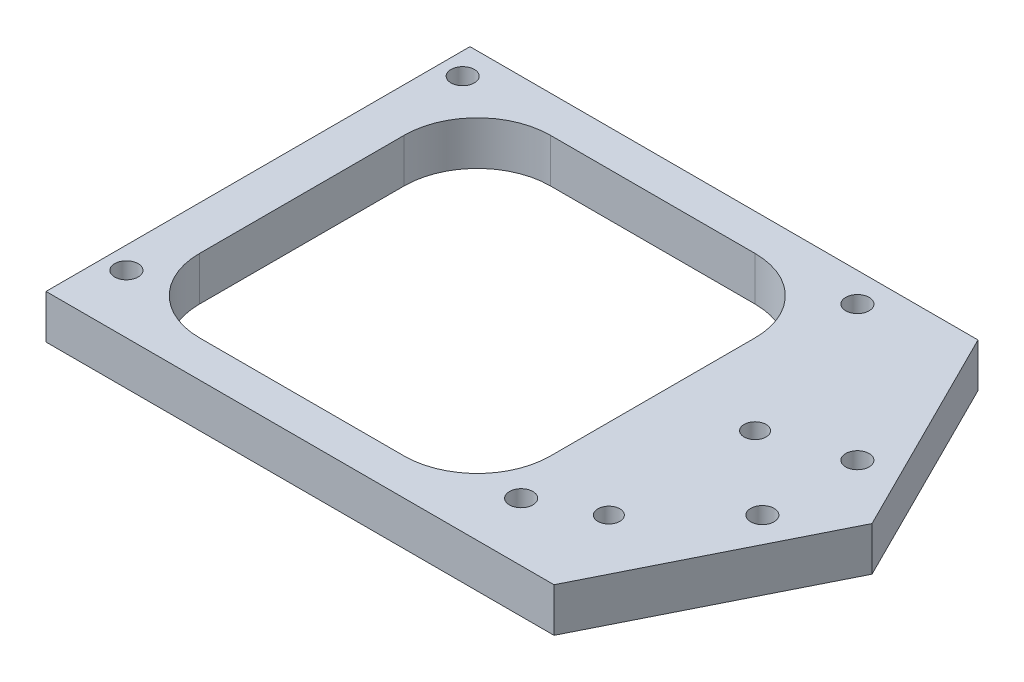
ISO-10303-21;
HEADER;
FILE_DESCRIPTION(('STEP AP214'),'2;1');
FILE_NAME('part.step','',(''),(''),'','','');
FILE_SCHEMA(('AUTOMOTIVE_DESIGN { 1 0 10303 214 1 1 1 1 }'));
ENDSEC;
DATA;
#1=APPLICATION_CONTEXT('core data for automotive mechanical design processes');
#2=APPLICATION_PROTOCOL_DEFINITION('international standard','automotive_design',2000,#1);
#3=PRODUCT_CONTEXT('',#1,'mechanical');
#4=PRODUCT('Part','Part','',(#3));
#5=PRODUCT_RELATED_PRODUCT_CATEGORY('part','',(#4));
#6=PRODUCT_DEFINITION_FORMATION('','',#4);
#7=PRODUCT_DEFINITION_CONTEXT('part definition',#1,'design');
#8=PRODUCT_DEFINITION('design','',#6,#7);
#9=PRODUCT_DEFINITION_SHAPE('','',#8);
#10=(LENGTH_UNIT() NAMED_UNIT(*) SI_UNIT(.MILLI.,.METRE.));
#11=(NAMED_UNIT(*) PLANE_ANGLE_UNIT() SI_UNIT($,.RADIAN.));
#12=(NAMED_UNIT(*) SI_UNIT($,.STERADIAN.) SOLID_ANGLE_UNIT());
#13=UNCERTAINTY_MEASURE_WITH_UNIT(LENGTH_MEASURE(1.E-05),#10,'distance_accuracy_value','');
#14=(GEOMETRIC_REPRESENTATION_CONTEXT(3) GLOBAL_UNCERTAINTY_ASSIGNED_CONTEXT((#13)) GLOBAL_UNIT_ASSIGNED_CONTEXT((#10,
#11,#12)) REPRESENTATION_CONTEXT('',''));
#15=CARTESIAN_POINT('',(0.,0.,0.));
#16=DIRECTION('',(0.,0.,1.));
#17=DIRECTION('',(1.,0.,0.));
#18=AXIS2_PLACEMENT_3D('',#15,#16,#17);
#19=CARTESIAN_POINT('',(0.,-1.5,0.));
#20=DIRECTION('',(0.,-1.,0.));
#21=DIRECTION('',(0.,0.,-1.));
#22=AXIS2_PLACEMENT_3D('',#19,#20,#21);
#23=PLANE('',#22);
#24=CARTESIAN_POINT('',(32.5,-1.5,-16.));
#25=DIRECTION('',(0.,1.,0.));
#26=DIRECTION('',(0.,0.,1.));
#27=AXIS2_PLACEMENT_3D('',#24,#25,#26);
#28=CIRCLE('',#27,0.750000000000001);
#29=CARTESIAN_POINT('',(32.5,-1.5,-15.25));
#30=VERTEX_POINT('',#29);
#31=EDGE_CURVE('E332',#30,#30,#28,.T.);
#32=ORIENTED_EDGE('',*,*,#31,.T.);
#33=EDGE_LOOP('',(#32));
#34=FACE_BOUND('',#33,.T.);
#35=DIRECTION('',(0.,0.,1.));
#36=VECTOR('',#35,1.);
#37=CARTESIAN_POINT('',(0.,-1.5,0.));
#38=LINE('',#37,#36);
#39=CARTESIAN_POINT('',(0.,-1.5,-29.));
#40=VERTEX_POINT('',#39);
#41=CARTESIAN_POINT('',(0.,-1.5,0.));
#42=VERTEX_POINT('',#41);
#43=EDGE_CURVE('E170',#40,#42,#38,.T.);
#44=ORIENTED_EDGE('',*,*,#43,.F.);
#45=DIRECTION('',(-1.,0.,0.));
#46=VECTOR('',#45,1.);
#47=CARTESIAN_POINT('',(0.,-1.5,-29.));
#48=LINE('',#47,#46);
#49=CARTESIAN_POINT('',(34.7484344171534,-1.5,-29.));
#50=VERTEX_POINT('',#49);
#51=EDGE_CURVE('E166',#50,#40,#48,.T.);
#52=ORIENTED_EDGE('',*,*,#51,.F.);
#53=DIRECTION('',(-0.447290848418716,0.,-0.894388560370081));
#54=VECTOR('',#53,1.);
#55=CARTESIAN_POINT('',(42.,-1.5,-14.5));
#56=LINE('',#55,#54);
#57=CARTESIAN_POINT('',(42.,-1.5,-14.5));
#58=VERTEX_POINT('',#57);
#59=EDGE_CURVE('E248',#58,#50,#56,.T.);
#60=ORIENTED_EDGE('',*,*,#59,.F.);
#61=DIRECTION('',(0.447290848418714,0.,-0.894388560370081));
#62=VECTOR('',#61,1.);
#63=CARTESIAN_POINT('',(42.,-1.5,-14.5));
#64=LINE('',#63,#62);
#65=CARTESIAN_POINT('',(34.7484344171535,-1.5,0.));
#66=VERTEX_POINT('',#65);
#67=EDGE_CURVE('E246',#66,#58,#64,.T.);
#68=ORIENTED_EDGE('',*,*,#67,.F.);
#69=DIRECTION('',(1.,0.,0.));
#70=VECTOR('',#69,1.);
#71=CARTESIAN_POINT('',(0.,-1.5,0.));
#72=LINE('',#71,#70);
#73=EDGE_CURVE('E244',#42,#66,#72,.T.);
#74=ORIENTED_EDGE('',*,*,#73,.F.);
#75=EDGE_LOOP('',(#44,#52,#60,#68,#74));
#76=FACE_BOUND('',#75,.T.);
#77=DIRECTION('',(-1.,0.,0.));
#78=VECTOR('',#77,1.);
#79=CARTESIAN_POINT('',(3.,-1.5,-26.5));
#80=LINE('',#79,#78);
#81=CARTESIAN_POINT('',(22.,-1.5,-26.5));
#82=VERTEX_POINT('',#81);
#83=CARTESIAN_POINT('',(8.,-1.5,-26.5));
#84=VERTEX_POINT('',#83);
#85=EDGE_CURVE('E231',#82,#84,#80,.T.);
#86=ORIENTED_EDGE('',*,*,#85,.T.);
#87=CARTESIAN_POINT('',(8.,-1.5,-21.5));
#88=DIRECTION('',(0.,-1.,0.));
#89=DIRECTION('',(0.,0.,-1.));
#90=AXIS2_PLACEMENT_3D('',#87,#88,#89);
#91=CIRCLE('',#90,5.);
#92=CARTESIAN_POINT('',(3.,-1.5,-21.5));
#93=VERTEX_POINT('',#92);
#94=EDGE_CURVE('E197',#84,#93,#91,.F.);
#95=ORIENTED_EDGE('',*,*,#94,.T.);
#96=DIRECTION('',(0.,0.,1.));
#97=VECTOR('',#96,1.);
#98=CARTESIAN_POINT('',(3.,-1.5,-26.5));
#99=LINE('',#98,#97);
#100=CARTESIAN_POINT('',(3.,-1.5,-7.50000000000001));
#101=VERTEX_POINT('',#100);
#102=EDGE_CURVE('E224',#93,#101,#99,.T.);
#103=ORIENTED_EDGE('',*,*,#102,.T.);
#104=CARTESIAN_POINT('',(8.,-1.5,-7.5));
#105=DIRECTION('',(0.,-1.,0.));
#106=DIRECTION('',(0.,0.,-1.));
#107=AXIS2_PLACEMENT_3D('',#104,#105,#106);
#108=CIRCLE('',#107,5.);
#109=CARTESIAN_POINT('',(8.,-1.5,-2.5));
#110=VERTEX_POINT('',#109);
#111=EDGE_CURVE('E13',#101,#110,#108,.F.);
#112=ORIENTED_EDGE('',*,*,#111,.T.);
#113=DIRECTION('',(1.,0.,0.));
#114=VECTOR('',#113,1.);
#115=CARTESIAN_POINT('',(3.,-1.5,-2.5));
#116=LINE('',#115,#114);
#117=CARTESIAN_POINT('',(22.,-1.5,-2.5));
#118=VERTEX_POINT('',#117);
#119=EDGE_CURVE('E222',#110,#118,#116,.T.);
#120=ORIENTED_EDGE('',*,*,#119,.T.);
#121=CARTESIAN_POINT('',(22.,-1.5,-7.5));
#122=DIRECTION('',(0.,-1.,0.));
#123=DIRECTION('',(0.,0.,-1.));
#124=AXIS2_PLACEMENT_3D('',#121,#122,#123);
#125=CIRCLE('',#124,5.);
#126=CARTESIAN_POINT('',(27.,-1.5,-7.50000000000001));
#127=VERTEX_POINT('',#126);
#128=EDGE_CURVE('E204',#118,#127,#125,.F.);
#129=ORIENTED_EDGE('',*,*,#128,.T.);
#130=DIRECTION('',(0.,0.,-1.));
#131=VECTOR('',#130,1.);
#132=CARTESIAN_POINT('',(27.,-1.5,-26.5));
#133=LINE('',#132,#131);
#134=CARTESIAN_POINT('',(27.,-1.5,-21.5));
#135=VERTEX_POINT('',#134);
#136=EDGE_CURVE('E228',#127,#135,#133,.T.);
#137=ORIENTED_EDGE('',*,*,#136,.T.);
#138=CARTESIAN_POINT('',(22.,-1.5,-21.5));
#139=DIRECTION('',(0.,-1.,0.));
#140=DIRECTION('',(0.,0.,-1.));
#141=AXIS2_PLACEMENT_3D('',#138,#139,#140);
#142=CIRCLE('',#141,5.);
#143=EDGE_CURVE('E201',#135,#82,#142,.F.);
#144=ORIENTED_EDGE('',*,*,#143,.T.);
#145=EDGE_LOOP('',(#86,#95,#103,#112,#120,#129,#137,#144));
#146=FACE_BOUND('',#145,.T.);
#147=CARTESIAN_POINT('',(1.5,-1.5,-4.));
#148=DIRECTION('',(0.,1.,0.));
#149=DIRECTION('',(0.,0.,1.));
#150=AXIS2_PLACEMENT_3D('',#147,#148,#149);
#151=CIRCLE('',#150,0.799999999999995);
#152=CARTESIAN_POINT('',(1.5,-1.5,-3.20000000000001));
#153=VERTEX_POINT('',#152);
#154=EDGE_CURVE('E214',#153,#153,#151,.T.);
#155=ORIENTED_EDGE('',*,*,#154,.T.);
#156=EDGE_LOOP('',(#155));
#157=FACE_BOUND('',#156,.T.);
#158=CARTESIAN_POINT('',(28.5,-1.5,-4.00000000000001));
#159=DIRECTION('',(0.,1.,0.));
#160=DIRECTION('',(0.,0.,1.));
#161=AXIS2_PLACEMENT_3D('',#158,#159,#160);
#162=CIRCLE('',#161,0.799999999999995);
#163=CARTESIAN_POINT('',(28.5,-1.5,-3.20000000000001));
#164=VERTEX_POINT('',#163);
#165=EDGE_CURVE('E372',#164,#164,#162,.T.);
#166=ORIENTED_EDGE('',*,*,#165,.T.);
#167=EDGE_LOOP('',(#166));
#168=FACE_BOUND('',#167,.T.);
#169=CARTESIAN_POINT('',(37.7484344171534,-1.5,-11.25));
#170=DIRECTION('',(0.,1.,0.));
#171=DIRECTION('',(0.,0.,1.));
#172=AXIS2_PLACEMENT_3D('',#169,#170,#171);
#173=CIRCLE('',#172,0.799999999999995);
#174=CARTESIAN_POINT('',(37.7484344171534,-1.5,-10.45));
#175=VERTEX_POINT('',#174);
#176=EDGE_CURVE('E366',#175,#175,#173,.T.);
#177=ORIENTED_EDGE('',*,*,#176,.T.);
#178=EDGE_LOOP('',(#177));
#179=FACE_BOUND('',#178,.T.);
#180=CARTESIAN_POINT('',(37.7484344171534,-1.5,-17.75));
#181=DIRECTION('',(0.,1.,0.));
#182=DIRECTION('',(0.,0.,1.));
#183=AXIS2_PLACEMENT_3D('',#180,#181,#182);
#184=CIRCLE('',#183,0.799999999999995);
#185=CARTESIAN_POINT('',(37.7484344171534,-1.5,-16.95));
#186=VERTEX_POINT('',#185);
#187=EDGE_CURVE('E360',#186,#186,#184,.T.);
#188=ORIENTED_EDGE('',*,*,#187,.T.);
#189=EDGE_LOOP('',(#188));
#190=FACE_BOUND('',#189,.T.);
#191=CARTESIAN_POINT('',(28.5,-1.5,-27.));
#192=DIRECTION('',(0.,1.,0.));
#193=DIRECTION('',(0.,0.,1.));
#194=AXIS2_PLACEMENT_3D('',#191,#192,#193);
#195=CIRCLE('',#194,0.799999999999995);
#196=CARTESIAN_POINT('',(28.5,-1.5,-26.2));
#197=VERTEX_POINT('',#196);
#198=EDGE_CURVE('E354',#197,#197,#195,.T.);
#199=ORIENTED_EDGE('',*,*,#198,.T.);
#200=EDGE_LOOP('',(#199));
#201=FACE_BOUND('',#200,.T.);
#202=CARTESIAN_POINT('',(1.5,-1.5,-27.));
#203=DIRECTION('',(0.,1.,0.));
#204=DIRECTION('',(0.,0.,1.));
#205=AXIS2_PLACEMENT_3D('',#202,#203,#204);
#206=CIRCLE('',#205,0.799999999999996);
#207=CARTESIAN_POINT('',(1.5,-1.5,-26.2));
#208=VERTEX_POINT('',#207);
#209=EDGE_CURVE('E348',#208,#208,#206,.T.);
#210=ORIENTED_EDGE('',*,*,#209,.T.);
#211=EDGE_LOOP('',(#210));
#212=FACE_BOUND('',#211,.T.);
#213=CARTESIAN_POINT('',(32.5,-1.5,-6.));
#214=DIRECTION('',(0.,1.,0.));
#215=DIRECTION('',(0.,0.,1.));
#216=AXIS2_PLACEMENT_3D('',#213,#214,#215);
#217=CIRCLE('',#216,0.750000000000001);
#218=CARTESIAN_POINT('',(32.5,-1.5,-5.25));
#219=VERTEX_POINT('',#218);
#220=EDGE_CURVE('E342',#219,#219,#217,.T.);
#221=ORIENTED_EDGE('',*,*,#220,.T.);
#222=EDGE_LOOP('',(#221));
#223=FACE_BOUND('',#222,.T.);
#224=ADVANCED_FACE('F50',(#34,#76,#146,#157,#168,#179,#190,#201,#212,#223),#23,.T.);
#225=CARTESIAN_POINT('',(0.,1.5,0.));
#226=DIRECTION('',(0.,-1.,0.));
#227=DIRECTION('',(0.,0.,-1.));
#228=AXIS2_PLACEMENT_3D('',#225,#226,#227);
#229=PLANE('',#228);
#230=CARTESIAN_POINT('',(32.5,1.5,-16.));
#231=DIRECTION('',(0.,1.,0.));
#232=DIRECTION('',(0.,0.,1.));
#233=AXIS2_PLACEMENT_3D('',#230,#231,#232);
#234=CIRCLE('',#233,0.750000000000001);
#235=CARTESIAN_POINT('',(32.5,1.5,-15.25));
#236=VERTEX_POINT('',#235);
#237=EDGE_CURVE('E335',#236,#236,#234,.T.);
#238=ORIENTED_EDGE('',*,*,#237,.F.);
#239=EDGE_LOOP('',(#238));
#240=FACE_BOUND('',#239,.T.);
#241=CARTESIAN_POINT('',(1.5,1.5,-27.));
#242=DIRECTION('',(0.,1.,0.));
#243=DIRECTION('',(0.,0.,1.));
#244=AXIS2_PLACEMENT_3D('',#241,#242,#243);
#245=CIRCLE('',#244,0.799999999999988);
#246=CARTESIAN_POINT('',(1.5,1.5,-26.2));
#247=VERTEX_POINT('',#246);
#248=EDGE_CURVE('E345',#247,#247,#245,.T.);
#249=ORIENTED_EDGE('',*,*,#248,.F.);
#250=EDGE_LOOP('',(#249));
#251=FACE_BOUND('',#250,.T.);
#252=CARTESIAN_POINT('',(28.5,1.5,-27.));
#253=DIRECTION('',(0.,1.,0.));
#254=DIRECTION('',(0.,0.,1.));
#255=AXIS2_PLACEMENT_3D('',#252,#253,#254);
#256=CIRCLE('',#255,0.799999999999988);
#257=CARTESIAN_POINT('',(28.5,1.5,-26.2));
#258=VERTEX_POINT('',#257);
#259=EDGE_CURVE('E351',#258,#258,#256,.T.);
#260=ORIENTED_EDGE('',*,*,#259,.F.);
#261=EDGE_LOOP('',(#260));
#262=FACE_BOUND('',#261,.T.);
#263=CARTESIAN_POINT('',(37.7484344171534,1.5,-17.75));
#264=DIRECTION('',(0.,1.,0.));
#265=DIRECTION('',(0.,0.,1.));
#266=AXIS2_PLACEMENT_3D('',#263,#264,#265);
#267=CIRCLE('',#266,0.799999999999988);
#268=CARTESIAN_POINT('',(37.7484344171534,1.5,-16.95));
#269=VERTEX_POINT('',#268);
#270=EDGE_CURVE('E357',#269,#269,#267,.T.);
#271=ORIENTED_EDGE('',*,*,#270,.F.);
#272=EDGE_LOOP('',(#271));
#273=FACE_BOUND('',#272,.T.);
#274=CARTESIAN_POINT('',(37.7484344171534,1.5,-11.25));
#275=DIRECTION('',(0.,1.,0.));
#276=DIRECTION('',(0.,0.,1.));
#277=AXIS2_PLACEMENT_3D('',#274,#275,#276);
#278=CIRCLE('',#277,0.799999999999988);
#279=CARTESIAN_POINT('',(37.7484344171534,1.5,-10.45));
#280=VERTEX_POINT('',#279);
#281=EDGE_CURVE('E363',#280,#280,#278,.T.);
#282=ORIENTED_EDGE('',*,*,#281,.F.);
#283=EDGE_LOOP('',(#282));
#284=FACE_BOUND('',#283,.T.);
#285=CARTESIAN_POINT('',(28.5,1.5,-4.00000000000001));
#286=DIRECTION('',(0.,1.,0.));
#287=DIRECTION('',(0.,0.,1.));
#288=AXIS2_PLACEMENT_3D('',#285,#286,#287);
#289=CIRCLE('',#288,0.799999999999988);
#290=CARTESIAN_POINT('',(28.5,1.5,-3.20000000000002));
#291=VERTEX_POINT('',#290);
#292=EDGE_CURVE('E369',#291,#291,#289,.T.);
#293=ORIENTED_EDGE('',*,*,#292,.F.);
#294=EDGE_LOOP('',(#293));
#295=FACE_BOUND('',#294,.T.);
#296=DIRECTION('',(1.,0.,0.));
#297=VECTOR('',#296,1.);
#298=CARTESIAN_POINT('',(3.,1.5,-2.5));
#299=LINE('',#298,#297);
#300=CARTESIAN_POINT('',(8.,1.5,-2.5));
#301=VERTEX_POINT('',#300);
#302=CARTESIAN_POINT('',(22.,1.5,-2.5));
#303=VERTEX_POINT('',#302);
#304=EDGE_CURVE('E208',#301,#303,#299,.T.);
#305=ORIENTED_EDGE('',*,*,#304,.F.);
#306=CARTESIAN_POINT('',(8.,1.5,-7.5));
#307=DIRECTION('',(0.,-1.,0.));
#308=DIRECTION('',(0.,0.,-1.));
#309=AXIS2_PLACEMENT_3D('',#306,#307,#308);
#310=CIRCLE('',#309,5.);
#311=CARTESIAN_POINT('',(3.,1.5,-7.50000000000001));
#312=VERTEX_POINT('',#311);
#313=EDGE_CURVE('E58',#301,#312,#310,.T.);
#314=ORIENTED_EDGE('',*,*,#313,.T.);
#315=DIRECTION('',(0.,0.,1.));
#316=VECTOR('',#315,1.);
#317=CARTESIAN_POINT('',(3.,1.5,-26.5));
#318=LINE('',#317,#316);
#319=CARTESIAN_POINT('',(3.,1.5,-21.5));
#320=VERTEX_POINT('',#319);
#321=EDGE_CURVE('E207',#320,#312,#318,.T.);
#322=ORIENTED_EDGE('',*,*,#321,.F.);
#323=CARTESIAN_POINT('',(8.,1.5,-21.5));
#324=DIRECTION('',(0.,-1.,0.));
#325=DIRECTION('',(0.,0.,-1.));
#326=AXIS2_PLACEMENT_3D('',#323,#324,#325);
#327=CIRCLE('',#326,5.);
#328=CARTESIAN_POINT('',(8.,1.5,-26.5));
#329=VERTEX_POINT('',#328);
#330=EDGE_CURVE('E195',#320,#329,#327,.T.);
#331=ORIENTED_EDGE('',*,*,#330,.T.);
#332=DIRECTION('',(-1.,0.,0.));
#333=VECTOR('',#332,1.);
#334=CARTESIAN_POINT('',(3.,1.5,-26.5));
#335=LINE('',#334,#333);
#336=CARTESIAN_POINT('',(22.,1.5,-26.5));
#337=VERTEX_POINT('',#336);
#338=EDGE_CURVE('E233',#337,#329,#335,.T.);
#339=ORIENTED_EDGE('',*,*,#338,.F.);
#340=CARTESIAN_POINT('',(22.,1.5,-21.5));
#341=DIRECTION('',(0.,-1.,0.));
#342=DIRECTION('',(0.,0.,-1.));
#343=AXIS2_PLACEMENT_3D('',#340,#341,#342);
#344=CIRCLE('',#343,5.);
#345=CARTESIAN_POINT('',(27.,1.5,-21.5));
#346=VERTEX_POINT('',#345);
#347=EDGE_CURVE('E199',#337,#346,#344,.T.);
#348=ORIENTED_EDGE('',*,*,#347,.T.);
#349=DIRECTION('',(0.,0.,-1.));
#350=VECTOR('',#349,1.);
#351=CARTESIAN_POINT('',(27.,1.5,-26.5));
#352=LINE('',#351,#350);
#353=CARTESIAN_POINT('',(27.,1.5,-7.50000000000001));
#354=VERTEX_POINT('',#353);
#355=EDGE_CURVE('E381',#354,#346,#352,.T.);
#356=ORIENTED_EDGE('',*,*,#355,.F.);
#357=CARTESIAN_POINT('',(22.,1.5,-7.5));
#358=DIRECTION('',(0.,-1.,0.));
#359=DIRECTION('',(0.,0.,-1.));
#360=AXIS2_PLACEMENT_3D('',#357,#358,#359);
#361=CIRCLE('',#360,5.);
#362=EDGE_CURVE('E65',#354,#303,#361,.T.);
#363=ORIENTED_EDGE('',*,*,#362,.T.);
#364=EDGE_LOOP('',(#305,#314,#322,#331,#339,#348,#356,#363));
#365=FACE_BOUND('',#364,.T.);
#366=DIRECTION('',(0.,0.,1.));
#367=VECTOR('',#366,1.);
#368=CARTESIAN_POINT('',(0.,1.5,0.));
#369=LINE('',#368,#367);
#370=CARTESIAN_POINT('',(0.,1.5,-29.));
#371=VERTEX_POINT('',#370);
#372=CARTESIAN_POINT('',(0.,1.5,0.));
#373=VERTEX_POINT('',#372);
#374=EDGE_CURVE('E156',#371,#373,#369,.T.);
#375=ORIENTED_EDGE('',*,*,#374,.T.);
#376=DIRECTION('',(1.,0.,0.));
#377=VECTOR('',#376,1.);
#378=CARTESIAN_POINT('',(0.,1.5,0.));
#379=LINE('',#378,#377);
#380=CARTESIAN_POINT('',(34.7484344171535,1.5,0.));
#381=VERTEX_POINT('',#380);
#382=EDGE_CURVE('E145',#373,#381,#379,.T.);
#383=ORIENTED_EDGE('',*,*,#382,.T.);
#384=DIRECTION('',(0.447290848418714,0.,-0.894388560370081));
#385=VECTOR('',#384,1.);
#386=CARTESIAN_POINT('',(42.,1.5,-14.5));
#387=LINE('',#386,#385);
#388=CARTESIAN_POINT('',(42.,1.5,-14.5));
#389=VERTEX_POINT('',#388);
#390=EDGE_CURVE('E155',#381,#389,#387,.T.);
#391=ORIENTED_EDGE('',*,*,#390,.T.);
#392=DIRECTION('',(-0.447290848418716,0.,-0.894388560370081));
#393=VECTOR('',#392,1.);
#394=CARTESIAN_POINT('',(42.,1.5,-14.5));
#395=LINE('',#394,#393);
#396=CARTESIAN_POINT('',(34.7484344171534,1.5,-29.));
#397=VERTEX_POINT('',#396);
#398=EDGE_CURVE('E239',#389,#397,#395,.T.);
#399=ORIENTED_EDGE('',*,*,#398,.T.);
#400=DIRECTION('',(-1.,0.,0.));
#401=VECTOR('',#400,1.);
#402=CARTESIAN_POINT('',(0.,1.5,-29.));
#403=LINE('',#402,#401);
#404=EDGE_CURVE('E162',#397,#371,#403,.T.);
#405=ORIENTED_EDGE('',*,*,#404,.T.);
#406=EDGE_LOOP('',(#375,#383,#391,#399,#405));
#407=FACE_BOUND('',#406,.T.);
#408=CARTESIAN_POINT('',(1.5,1.5,-4.));
#409=DIRECTION('',(0.,1.,0.));
#410=DIRECTION('',(0.,0.,1.));
#411=AXIS2_PLACEMENT_3D('',#408,#409,#410);
#412=CIRCLE('',#411,0.799999999999988);
#413=CARTESIAN_POINT('',(1.5,1.5,-3.20000000000002));
#414=VERTEX_POINT('',#413);
#415=EDGE_CURVE('E375',#414,#414,#412,.T.);
#416=ORIENTED_EDGE('',*,*,#415,.F.);
#417=EDGE_LOOP('',(#416));
#418=FACE_BOUND('',#417,.T.);
#419=CARTESIAN_POINT('',(32.5,1.5,-6.));
#420=DIRECTION('',(0.,1.,0.));
#421=DIRECTION('',(0.,0.,1.));
#422=AXIS2_PLACEMENT_3D('',#419,#420,#421);
#423=CIRCLE('',#422,0.750000000000001);
#424=CARTESIAN_POINT('',(32.5,1.5,-5.25));
#425=VERTEX_POINT('',#424);
#426=EDGE_CURVE('E337',#425,#425,#423,.T.);
#427=ORIENTED_EDGE('',*,*,#426,.F.);
#428=EDGE_LOOP('',(#427));
#429=FACE_BOUND('',#428,.T.);
#430=ADVANCED_FACE('F159',(#240,#251,#262,#273,#284,#295,#365,#407,#418,#429),#229,.F.);
#431=CARTESIAN_POINT('',(0.,1.5,0.));
#432=DIRECTION('',(1.,0.,0.));
#433=DIRECTION('',(0.,0.,-1.));
#434=AXIS2_PLACEMENT_3D('',#431,#432,#433);
#435=PLANE('',#434);
#436=ORIENTED_EDGE('',*,*,#43,.T.);
#437=DIRECTION('',(0.,-1.,0.));
#438=VECTOR('',#437,1.);
#439=CARTESIAN_POINT('',(0.,1.5,0.));
#440=LINE('',#439,#438);
#441=EDGE_CURVE('E149',#373,#42,#440,.T.);
#442=ORIENTED_EDGE('',*,*,#441,.F.);
#443=ORIENTED_EDGE('',*,*,#374,.F.);
#444=DIRECTION('',(0.,-1.,0.));
#445=VECTOR('',#444,1.);
#446=CARTESIAN_POINT('',(0.,1.5,-29.));
#447=LINE('',#446,#445);
#448=EDGE_CURVE('E242',#371,#40,#447,.T.);
#449=ORIENTED_EDGE('',*,*,#448,.T.);
#450=EDGE_LOOP('',(#436,#442,#443,#449));
#451=FACE_BOUND('',#450,.T.);
#452=ADVANCED_FACE('F168',(#451),#435,.F.);
#453=CARTESIAN_POINT('',(0.,1.5,0.));
#454=DIRECTION('',(0.,0.,-1.));
#455=DIRECTION('',(-1.,0.,0.));
#456=AXIS2_PLACEMENT_3D('',#453,#454,#455);
#457=PLANE('',#456);
#458=ORIENTED_EDGE('',*,*,#73,.T.);
#459=DIRECTION('',(0.,-1.,0.));
#460=VECTOR('',#459,1.);
#461=CARTESIAN_POINT('',(34.7484344171535,1.5,0.));
#462=LINE('',#461,#460);
#463=EDGE_CURVE('E152',#381,#66,#462,.T.);
#464=ORIENTED_EDGE('',*,*,#463,.F.);
#465=ORIENTED_EDGE('',*,*,#382,.F.);
#466=ORIENTED_EDGE('',*,*,#441,.T.);
#467=EDGE_LOOP('',(#458,#464,#465,#466));
#468=FACE_BOUND('',#467,.T.);
#469=ADVANCED_FACE('F147',(#468),#457,.F.);
#470=CARTESIAN_POINT('',(42.,1.5,-14.5));
#471=DIRECTION('',(-0.894388560370082,0.,-0.447290848418714));
#472=DIRECTION('',(-0.447290848418714,0.,0.894388560370082));
#473=AXIS2_PLACEMENT_3D('',#470,#471,#472);
#474=PLANE('',#473);
#475=ORIENTED_EDGE('',*,*,#67,.T.);
#476=DIRECTION('',(0.,-1.,0.));
#477=VECTOR('',#476,1.);
#478=CARTESIAN_POINT('',(42.,1.5,-14.5));
#479=LINE('',#478,#477);
#480=EDGE_CURVE('E175',#389,#58,#479,.T.);
#481=ORIENTED_EDGE('',*,*,#480,.F.);
#482=ORIENTED_EDGE('',*,*,#390,.F.);
#483=ORIENTED_EDGE('',*,*,#463,.T.);
#484=EDGE_LOOP('',(#475,#481,#482,#483));
#485=FACE_BOUND('',#484,.T.);
#486=ADVANCED_FACE('F275',(#485),#474,.F.);
#487=CARTESIAN_POINT('',(42.,1.5,-14.5));
#488=DIRECTION('',(-0.894388560370081,0.,0.447290848418716));
#489=DIRECTION('',(0.447290848418716,0.,0.894388560370081));
#490=AXIS2_PLACEMENT_3D('',#487,#488,#489);
#491=PLANE('',#490);
#492=ORIENTED_EDGE('',*,*,#59,.T.);
#493=DIRECTION('',(0.,-1.,0.));
#494=VECTOR('',#493,1.);
#495=CARTESIAN_POINT('',(34.7484344171534,1.5,-29.));
#496=LINE('',#495,#494);
#497=EDGE_CURVE('E252',#397,#50,#496,.T.);
#498=ORIENTED_EDGE('',*,*,#497,.F.);
#499=ORIENTED_EDGE('',*,*,#398,.F.);
#500=ORIENTED_EDGE('',*,*,#480,.T.);
#501=EDGE_LOOP('',(#492,#498,#499,#500));
#502=FACE_BOUND('',#501,.T.);
#503=ADVANCED_FACE('F259',(#502),#491,.F.);
#504=CARTESIAN_POINT('',(0.,1.5,-29.));
#505=DIRECTION('',(0.,0.,1.));
#506=DIRECTION('',(1.,0.,0.));
#507=AXIS2_PLACEMENT_3D('',#504,#505,#506);
#508=PLANE('',#507);
#509=ORIENTED_EDGE('',*,*,#51,.T.);
#510=ORIENTED_EDGE('',*,*,#448,.F.);
#511=ORIENTED_EDGE('',*,*,#404,.F.);
#512=ORIENTED_EDGE('',*,*,#497,.T.);
#513=EDGE_LOOP('',(#509,#510,#511,#512));
#514=FACE_BOUND('',#513,.T.);
#515=ADVANCED_FACE('F266',(#514),#508,.F.);
#516=CARTESIAN_POINT('',(3.,-1.5,-26.5));
#517=DIRECTION('',(-1.,0.,0.));
#518=DIRECTION('',(0.,0.,1.));
#519=AXIS2_PLACEMENT_3D('',#516,#517,#518);
#520=PLANE('',#519);
#521=ORIENTED_EDGE('',*,*,#102,.F.);
#522=DIRECTION('',(0.,1.,0.));
#523=VECTOR('',#522,1.);
#524=CARTESIAN_POINT('',(3.,1.5,-21.5));
#525=LINE('',#524,#523);
#526=EDGE_CURVE('E173',#93,#320,#525,.T.);
#527=ORIENTED_EDGE('',*,*,#526,.T.);
#528=ORIENTED_EDGE('',*,*,#321,.T.);
#529=DIRECTION('',(0.,1.,0.));
#530=VECTOR('',#529,1.);
#531=CARTESIAN_POINT('',(3.,-1.5,-7.5));
#532=LINE('',#531,#530);
#533=EDGE_CURVE('E171',#312,#101,#532,.F.);
#534=ORIENTED_EDGE('',*,*,#533,.T.);
#535=EDGE_LOOP('',(#521,#527,#528,#534));
#536=FACE_BOUND('',#535,.T.);
#537=ADVANCED_FACE('F211',(#536),#520,.F.);
#538=CARTESIAN_POINT('',(3.,-1.5,-26.5));
#539=DIRECTION('',(0.,0.,-1.));
#540=DIRECTION('',(-1.,0.,0.));
#541=AXIS2_PLACEMENT_3D('',#538,#539,#540);
#542=PLANE('',#541);
#543=ORIENTED_EDGE('',*,*,#338,.T.);
#544=DIRECTION('',(0.,1.,0.));
#545=VECTOR('',#544,1.);
#546=CARTESIAN_POINT('',(8.,-1.5,-26.5));
#547=LINE('',#546,#545);
#548=EDGE_CURVE('E184',#329,#84,#547,.F.);
#549=ORIENTED_EDGE('',*,*,#548,.T.);
#550=ORIENTED_EDGE('',*,*,#85,.F.);
#551=DIRECTION('',(0.,1.,0.));
#552=VECTOR('',#551,1.);
#553=CARTESIAN_POINT('',(22.,1.5,-26.5));
#554=LINE('',#553,#552);
#555=EDGE_CURVE('E181',#82,#337,#554,.T.);
#556=ORIENTED_EDGE('',*,*,#555,.T.);
#557=EDGE_LOOP('',(#543,#549,#550,#556));
#558=FACE_BOUND('',#557,.T.);
#559=ADVANCED_FACE('F273',(#558),#542,.F.);
#560=CARTESIAN_POINT('',(27.,-1.5,-26.5));
#561=DIRECTION('',(1.,0.,0.));
#562=DIRECTION('',(0.,0.,-1.));
#563=AXIS2_PLACEMENT_3D('',#560,#561,#562);
#564=PLANE('',#563);
#565=ORIENTED_EDGE('',*,*,#355,.T.);
#566=DIRECTION('',(0.,1.,0.));
#567=VECTOR('',#566,1.);
#568=CARTESIAN_POINT('',(27.,-1.5,-21.5));
#569=LINE('',#568,#567);
#570=EDGE_CURVE('E189',#346,#135,#569,.F.);
#571=ORIENTED_EDGE('',*,*,#570,.T.);
#572=ORIENTED_EDGE('',*,*,#136,.F.);
#573=DIRECTION('',(0.,1.,0.));
#574=VECTOR('',#573,1.);
#575=CARTESIAN_POINT('',(27.,1.5,-7.5));
#576=LINE('',#575,#574);
#577=EDGE_CURVE('E186',#127,#354,#576,.T.);
#578=ORIENTED_EDGE('',*,*,#577,.T.);
#579=EDGE_LOOP('',(#565,#571,#572,#578));
#580=FACE_BOUND('',#579,.T.);
#581=ADVANCED_FACE('F290',(#580),#564,.F.);
#582=CARTESIAN_POINT('',(3.,-1.5,-2.5));
#583=DIRECTION('',(0.,0.,1.));
#584=DIRECTION('',(1.,0.,0.));
#585=AXIS2_PLACEMENT_3D('',#582,#583,#584);
#586=PLANE('',#585);
#587=ORIENTED_EDGE('',*,*,#304,.T.);
#588=DIRECTION('',(0.,1.,0.));
#589=VECTOR('',#588,1.);
#590=CARTESIAN_POINT('',(22.,-1.5,-2.5));
#591=LINE('',#590,#589);
#592=EDGE_CURVE('E193',#303,#118,#591,.F.);
#593=ORIENTED_EDGE('',*,*,#592,.T.);
#594=ORIENTED_EDGE('',*,*,#119,.F.);
#595=DIRECTION('',(0.,1.,0.));
#596=VECTOR('',#595,1.);
#597=CARTESIAN_POINT('',(8.,1.5,-2.5));
#598=LINE('',#597,#596);
#599=EDGE_CURVE('E191',#110,#301,#598,.T.);
#600=ORIENTED_EDGE('',*,*,#599,.T.);
#601=EDGE_LOOP('',(#587,#593,#594,#600));
#602=FACE_BOUND('',#601,.T.);
#603=ADVANCED_FACE('F226',(#602),#586,.F.);
#604=CARTESIAN_POINT('',(8.,-1.5,-21.5));
#605=DIRECTION('',(0.,-1.,0.));
#606=DIRECTION('',(0.,0.,-1.));
#607=AXIS2_PLACEMENT_3D('',#604,#605,#606);
#608=CYLINDRICAL_SURFACE('',#607,5.);
#609=ORIENTED_EDGE('',*,*,#94,.F.);
#610=ORIENTED_EDGE('',*,*,#548,.F.);
#611=ORIENTED_EDGE('',*,*,#330,.F.);
#612=ORIENTED_EDGE('',*,*,#526,.F.);
#613=EDGE_LOOP('',(#609,#610,#611,#612));
#614=FACE_BOUND('',#613,.T.);
#615=ADVANCED_FACE('F289',(#614),#608,.F.);
#616=CARTESIAN_POINT('',(22.,-1.5,-21.5));
#617=DIRECTION('',(0.,-1.,0.));
#618=DIRECTION('',(0.,0.,-1.));
#619=AXIS2_PLACEMENT_3D('',#616,#617,#618);
#620=CYLINDRICAL_SURFACE('',#619,5.);
#621=ORIENTED_EDGE('',*,*,#143,.F.);
#622=ORIENTED_EDGE('',*,*,#570,.F.);
#623=ORIENTED_EDGE('',*,*,#347,.F.);
#624=ORIENTED_EDGE('',*,*,#555,.F.);
#625=EDGE_LOOP('',(#621,#622,#623,#624));
#626=FACE_BOUND('',#625,.T.);
#627=ADVANCED_FACE('F392',(#626),#620,.F.);
#628=CARTESIAN_POINT('',(22.,-1.5,-7.5));
#629=DIRECTION('',(0.,-1.,0.));
#630=DIRECTION('',(0.,0.,-1.));
#631=AXIS2_PLACEMENT_3D('',#628,#629,#630);
#632=CYLINDRICAL_SURFACE('',#631,5.);
#633=ORIENTED_EDGE('',*,*,#128,.F.);
#634=ORIENTED_EDGE('',*,*,#592,.F.);
#635=ORIENTED_EDGE('',*,*,#362,.F.);
#636=ORIENTED_EDGE('',*,*,#577,.F.);
#637=EDGE_LOOP('',(#633,#634,#635,#636));
#638=FACE_BOUND('',#637,.T.);
#639=ADVANCED_FACE('F397',(#638),#632,.F.);
#640=CARTESIAN_POINT('',(8.,-1.5,-7.5));
#641=DIRECTION('',(0.,-1.,0.));
#642=DIRECTION('',(0.,0.,-1.));
#643=AXIS2_PLACEMENT_3D('',#640,#641,#642);
#644=CYLINDRICAL_SURFACE('',#643,5.);
#645=ORIENTED_EDGE('',*,*,#111,.F.);
#646=ORIENTED_EDGE('',*,*,#533,.F.);
#647=ORIENTED_EDGE('',*,*,#313,.F.);
#648=ORIENTED_EDGE('',*,*,#599,.F.);
#649=EDGE_LOOP('',(#645,#646,#647,#648));
#650=FACE_BOUND('',#649,.T.);
#651=ADVANCED_FACE('F52',(#650),#644,.F.);
#652=CARTESIAN_POINT('',(1.5,1.5,-4.));
#653=DIRECTION('',(0.,1.,0.));
#654=DIRECTION('',(0.,0.,1.));
#655=AXIS2_PLACEMENT_3D('',#652,#653,#654);
#656=CYLINDRICAL_SURFACE('',#655,0.799999999999992);
#657=ORIENTED_EDGE('',*,*,#154,.F.);
#658=EDGE_LOOP('',(#657));
#659=FACE_BOUND('',#658,.T.);
#660=ORIENTED_EDGE('',*,*,#415,.T.);
#661=EDGE_LOOP('',(#660));
#662=FACE_BOUND('',#661,.T.);
#663=ADVANCED_FACE('F297',(#659,#662),#656,.F.);
#664=CARTESIAN_POINT('',(28.5,1.5,-4.00000000000001));
#665=DIRECTION('',(0.,1.,0.));
#666=DIRECTION('',(0.,0.,1.));
#667=AXIS2_PLACEMENT_3D('',#664,#665,#666);
#668=CYLINDRICAL_SURFACE('',#667,0.799999999999992);
#669=ORIENTED_EDGE('',*,*,#165,.F.);
#670=EDGE_LOOP('',(#669));
#671=FACE_BOUND('',#670,.T.);
#672=ORIENTED_EDGE('',*,*,#292,.T.);
#673=EDGE_LOOP('',(#672));
#674=FACE_BOUND('',#673,.T.);
#675=ADVANCED_FACE('F300',(#671,#674),#668,.F.);
#676=CARTESIAN_POINT('',(37.7484344171534,1.5,-11.25));
#677=DIRECTION('',(0.,1.,0.));
#678=DIRECTION('',(0.,0.,1.));
#679=AXIS2_PLACEMENT_3D('',#676,#677,#678);
#680=CYLINDRICAL_SURFACE('',#679,0.799999999999992);
#681=ORIENTED_EDGE('',*,*,#176,.F.);
#682=EDGE_LOOP('',(#681));
#683=FACE_BOUND('',#682,.T.);
#684=ORIENTED_EDGE('',*,*,#281,.T.);
#685=EDGE_LOOP('',(#684));
#686=FACE_BOUND('',#685,.T.);
#687=ADVANCED_FACE('F304',(#683,#686),#680,.F.);
#688=CARTESIAN_POINT('',(37.7484344171534,1.5,-17.75));
#689=DIRECTION('',(0.,1.,0.));
#690=DIRECTION('',(0.,0.,1.));
#691=AXIS2_PLACEMENT_3D('',#688,#689,#690);
#692=CYLINDRICAL_SURFACE('',#691,0.799999999999992);
#693=ORIENTED_EDGE('',*,*,#187,.F.);
#694=EDGE_LOOP('',(#693));
#695=FACE_BOUND('',#694,.T.);
#696=ORIENTED_EDGE('',*,*,#270,.T.);
#697=EDGE_LOOP('',(#696));
#698=FACE_BOUND('',#697,.T.);
#699=ADVANCED_FACE('F308',(#695,#698),#692,.F.);
#700=CARTESIAN_POINT('',(28.5,1.5,-27.));
#701=DIRECTION('',(0.,1.,0.));
#702=DIRECTION('',(0.,0.,1.));
#703=AXIS2_PLACEMENT_3D('',#700,#701,#702);
#704=CYLINDRICAL_SURFACE('',#703,0.799999999999992);
#705=ORIENTED_EDGE('',*,*,#198,.F.);
#706=EDGE_LOOP('',(#705));
#707=FACE_BOUND('',#706,.T.);
#708=ORIENTED_EDGE('',*,*,#259,.T.);
#709=EDGE_LOOP('',(#708));
#710=FACE_BOUND('',#709,.T.);
#711=ADVANCED_FACE('F312',(#707,#710),#704,.F.);
#712=CARTESIAN_POINT('',(1.5,1.5,-27.));
#713=DIRECTION('',(0.,1.,0.));
#714=DIRECTION('',(0.,0.,1.));
#715=AXIS2_PLACEMENT_3D('',#712,#713,#714);
#716=CYLINDRICAL_SURFACE('',#715,0.799999999999992);
#717=ORIENTED_EDGE('',*,*,#209,.F.);
#718=EDGE_LOOP('',(#717));
#719=FACE_BOUND('',#718,.T.);
#720=ORIENTED_EDGE('',*,*,#248,.T.);
#721=EDGE_LOOP('',(#720));
#722=FACE_BOUND('',#721,.T.);
#723=ADVANCED_FACE('F316',(#719,#722),#716,.F.);
#724=CARTESIAN_POINT('',(32.5,1.5,-6.));
#725=DIRECTION('',(0.,1.,0.));
#726=DIRECTION('',(0.,0.,1.));
#727=AXIS2_PLACEMENT_3D('',#724,#725,#726);
#728=CYLINDRICAL_SURFACE('',#727,0.750000000000001);
#729=ORIENTED_EDGE('',*,*,#220,.F.);
#730=EDGE_LOOP('',(#729));
#731=FACE_BOUND('',#730,.T.);
#732=ORIENTED_EDGE('',*,*,#426,.T.);
#733=EDGE_LOOP('',(#732));
#734=FACE_BOUND('',#733,.T.);
#735=ADVANCED_FACE('F320',(#731,#734),#728,.F.);
#736=CARTESIAN_POINT('',(32.5,1.5,-16.));
#737=DIRECTION('',(0.,1.,0.));
#738=DIRECTION('',(0.,0.,1.));
#739=AXIS2_PLACEMENT_3D('',#736,#737,#738);
#740=CYLINDRICAL_SURFACE('',#739,0.750000000000001);
#741=ORIENTED_EDGE('',*,*,#31,.F.);
#742=EDGE_LOOP('',(#741));
#743=FACE_BOUND('',#742,.T.);
#744=ORIENTED_EDGE('',*,*,#237,.T.);
#745=EDGE_LOOP('',(#744));
#746=FACE_BOUND('',#745,.T.);
#747=ADVANCED_FACE('F324',(#743,#746),#740,.F.);
#748=CLOSED_SHELL('',(#224,#430,#452,#469,#486,#503,#515,#537,#559,#581,#603,#615,#627,#639,
#651,#663,#675,#687,#699,#711,#723,#735,#747));
#749=MANIFOLD_SOLID_BREP('B2',#748);
#750=ADVANCED_BREP_SHAPE_REPRESENTATION('',(#18,#749),#14);
#751=SHAPE_DEFINITION_REPRESENTATION(#9,#750);
ENDSEC;
END-ISO-10303-21;
